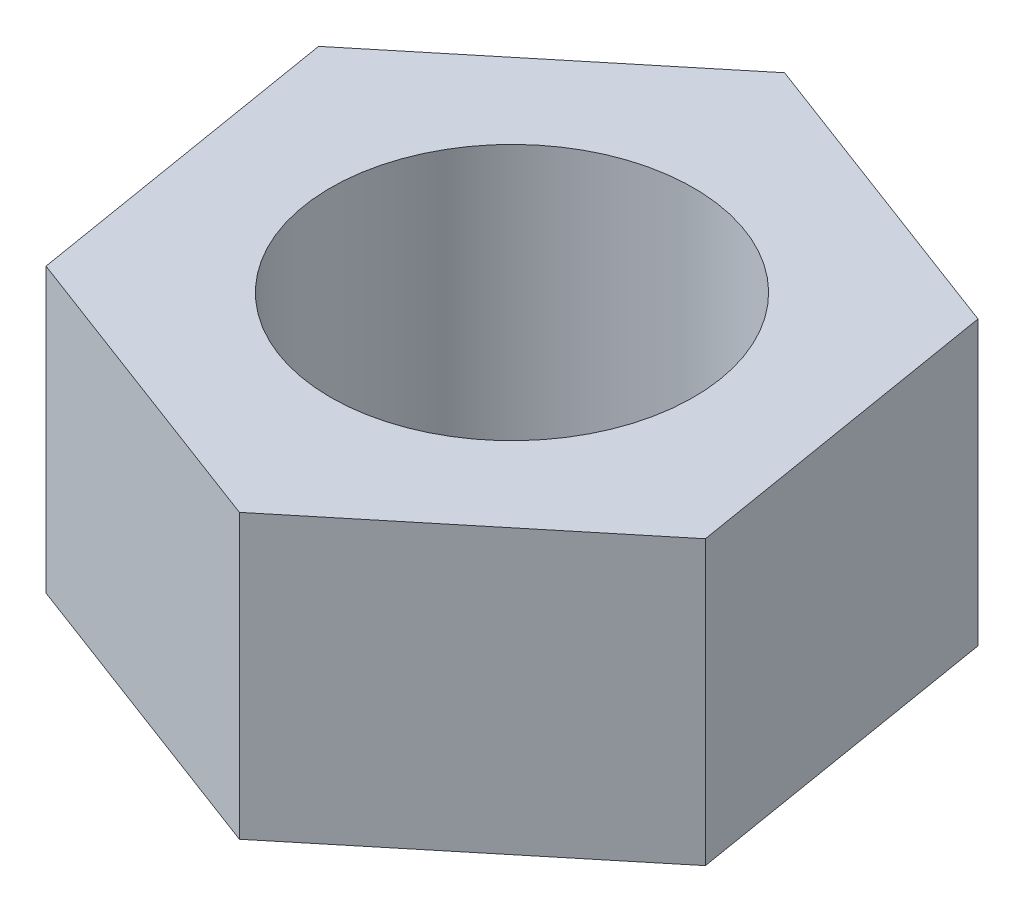
ISO-10303-21;
HEADER;
FILE_DESCRIPTION(('STEP AP214'),'2;1');
FILE_NAME('part.step','',(''),(''),'','','');
FILE_SCHEMA(('AUTOMOTIVE_DESIGN { 1 0 10303 214 1 1 1 1 }'));
ENDSEC;
DATA;
#1=APPLICATION_CONTEXT('core data for automotive mechanical design processes');
#2=APPLICATION_PROTOCOL_DEFINITION('international standard','automotive_design',2000,#1);
#3=PRODUCT_CONTEXT('',#1,'mechanical');
#4=PRODUCT('Part','Part','',(#3));
#5=PRODUCT_RELATED_PRODUCT_CATEGORY('part','',(#4));
#6=PRODUCT_DEFINITION_FORMATION('','',#4);
#7=PRODUCT_DEFINITION_CONTEXT('part definition',#1,'design');
#8=PRODUCT_DEFINITION('design','',#6,#7);
#9=PRODUCT_DEFINITION_SHAPE('','',#8);
#10=(LENGTH_UNIT() NAMED_UNIT(*) SI_UNIT(.MILLI.,.METRE.));
#11=(NAMED_UNIT(*) PLANE_ANGLE_UNIT() SI_UNIT($,.RADIAN.));
#12=(NAMED_UNIT(*) SI_UNIT($,.STERADIAN.) SOLID_ANGLE_UNIT());
#13=UNCERTAINTY_MEASURE_WITH_UNIT(LENGTH_MEASURE(1.E-05),#10,'distance_accuracy_value','');
#14=(GEOMETRIC_REPRESENTATION_CONTEXT(3) GLOBAL_UNCERTAINTY_ASSIGNED_CONTEXT((#13)) GLOBAL_UNIT_ASSIGNED_CONTEXT((#10,
#11,#12)) REPRESENTATION_CONTEXT('',''));
#15=CARTESIAN_POINT('',(0.,0.,0.));
#16=DIRECTION('',(0.,0.,1.));
#17=DIRECTION('',(1.,0.,0.));
#18=AXIS2_PLACEMENT_3D('',#15,#16,#17);
#19=CARTESIAN_POINT('',(0.,3.9,0.));
#20=DIRECTION('',(0.,1.,0.));
#21=DIRECTION('',(0.,0.,1.));
#22=AXIS2_PLACEMENT_3D('',#19,#20,#21);
#23=PLANE('',#22);
#24=DIRECTION('',(-0.163255074039928,0.,-0.986583894456127));
#25=VECTOR('',#24,1.);
#26=CARTESIAN_POINT('',(4.26931505882862,3.9,1.60508014185974));
#27=LINE('',#26,#25);
#28=CARTESIAN_POINT('',(4.26931505882862,3.9,1.60508014185974));
#29=VERTEX_POINT('',#28);
#30=CARTESIAN_POINT('',(3.52469770737478,3.9,-2.89479522677517));
#31=VERTEX_POINT('',#30);
#32=EDGE_CURVE('E146',#29,#31,#27,.T.);
#33=ORIENTED_EDGE('',*,*,#32,.T.);
#34=DIRECTION('',(-0.936034252583555,0.,-0.351908905812776));
#35=VECTOR('',#34,1.);
#36=CARTESIAN_POINT('',(3.52469770737478,3.9,-2.89479522677517));
#37=LINE('',#36,#35);
#38=CARTESIAN_POINT('',(-0.744617351453845,3.9,-4.49987536863491));
#39=VERTEX_POINT('',#38);
#40=EDGE_CURVE('E94',#31,#39,#37,.T.);
#41=ORIENTED_EDGE('',*,*,#40,.T.);
#42=DIRECTION('',(-0.772779178543627,0.,0.63467498864335));
#43=VECTOR('',#42,1.);
#44=CARTESIAN_POINT('',(-0.744617351453845,3.9,-4.49987536863491));
#45=LINE('',#44,#43);
#46=CARTESIAN_POINT('',(-4.26931505882862,3.9,-1.60508014185974));
#47=VERTEX_POINT('',#46);
#48=EDGE_CURVE('E107',#39,#47,#45,.T.);
#49=ORIENTED_EDGE('',*,*,#48,.T.);
#50=DIRECTION('',(0.163255074039928,0.,0.986583894456126));
#51=VECTOR('',#50,1.);
#52=CARTESIAN_POINT('',(-4.26931505882862,3.9,-1.60508014185974));
#53=LINE('',#52,#51);
#54=CARTESIAN_POINT('',(-3.52469770737478,3.9,2.89479522677517));
#55=VERTEX_POINT('',#54);
#56=EDGE_CURVE('E101',#47,#55,#53,.T.);
#57=ORIENTED_EDGE('',*,*,#56,.T.);
#58=DIRECTION('',(0.936034252583555,0.,0.351908905812776));
#59=VECTOR('',#58,1.);
#60=CARTESIAN_POINT('',(-3.52469770737478,3.9,2.89479522677517));
#61=LINE('',#60,#59);
#62=CARTESIAN_POINT('',(0.744617351453847,3.9,4.49987536863491));
#63=VERTEX_POINT('',#62);
#64=EDGE_CURVE('E105',#55,#63,#61,.T.);
#65=ORIENTED_EDGE('',*,*,#64,.T.);
#66=DIRECTION('',(0.772779178543627,0.,-0.634674988643351));
#67=VECTOR('',#66,1.);
#68=CARTESIAN_POINT('',(0.744617351453847,3.9,4.49987536863491));
#69=LINE('',#68,#67);
#70=EDGE_CURVE('E57',#63,#29,#69,.T.);
#71=ORIENTED_EDGE('',*,*,#70,.T.);
#72=EDGE_LOOP('',(#33,#41,#49,#57,#65,#71));
#73=FACE_BOUND('',#72,.T.);
#74=CARTESIAN_POINT('',(0.,3.9,0.));
#75=DIRECTION('',(0.,1.,0.));
#76=DIRECTION('',(0.,0.,1.));
#77=AXIS2_PLACEMENT_3D('',#74,#75,#76);
#78=CIRCLE('',#77,2.5);
#79=CARTESIAN_POINT('',(0.,3.9,2.5));
#80=VERTEX_POINT('',#79);
#81=EDGE_CURVE('E134',#80,#80,#78,.T.);
#82=ORIENTED_EDGE('',*,*,#81,.F.);
#83=EDGE_LOOP('',(#82));
#84=FACE_BOUND('',#83,.T.);
#85=ADVANCED_FACE('F39',(#73,#84),#23,.T.);
#86=CARTESIAN_POINT('',(0.,0.,0.));
#87=DIRECTION('',(0.,1.,0.));
#88=DIRECTION('',(0.,0.,1.));
#89=AXIS2_PLACEMENT_3D('',#86,#87,#88);
#90=PLANE('',#89);
#91=DIRECTION('',(-0.163255074039928,0.,-0.986583894456127));
#92=VECTOR('',#91,1.);
#93=CARTESIAN_POINT('',(4.26931505882862,0.,1.60508014185974));
#94=LINE('',#93,#92);
#95=CARTESIAN_POINT('',(4.26931505882862,0.,1.60508014185974));
#96=VERTEX_POINT('',#95);
#97=CARTESIAN_POINT('',(3.52469770737478,0.,-2.89479522677517));
#98=VERTEX_POINT('',#97);
#99=EDGE_CURVE('E129',#96,#98,#94,.T.);
#100=ORIENTED_EDGE('',*,*,#99,.F.);
#101=DIRECTION('',(0.772779178543627,0.,-0.634674988643351));
#102=VECTOR('',#101,1.);
#103=CARTESIAN_POINT('',(0.744617351453847,0.,4.49987536863491));
#104=LINE('',#103,#102);
#105=CARTESIAN_POINT('',(0.744617351453847,0.,4.49987536863491));
#106=VERTEX_POINT('',#105);
#107=EDGE_CURVE('E86',#106,#96,#104,.T.);
#108=ORIENTED_EDGE('',*,*,#107,.F.);
#109=DIRECTION('',(0.936034252583555,0.,0.351908905812776));
#110=VECTOR('',#109,1.);
#111=CARTESIAN_POINT('',(-3.52469770737478,0.,2.89479522677517));
#112=LINE('',#111,#110);
#113=CARTESIAN_POINT('',(-3.52469770737478,0.,2.89479522677517));
#114=VERTEX_POINT('',#113);
#115=EDGE_CURVE('E80',#114,#106,#112,.T.);
#116=ORIENTED_EDGE('',*,*,#115,.F.);
#117=DIRECTION('',(0.163255074039928,0.,0.986583894456126));
#118=VECTOR('',#117,1.);
#119=CARTESIAN_POINT('',(-4.26931505882862,0.,-1.60508014185974));
#120=LINE('',#119,#118);
#121=CARTESIAN_POINT('',(-4.26931505882862,0.,-1.60508014185974));
#122=VERTEX_POINT('',#121);
#123=EDGE_CURVE('E116',#122,#114,#120,.T.);
#124=ORIENTED_EDGE('',*,*,#123,.F.);
#125=DIRECTION('',(-0.772779178543627,0.,0.63467498864335));
#126=VECTOR('',#125,1.);
#127=CARTESIAN_POINT('',(-0.744617351453845,0.,-4.49987536863491));
#128=LINE('',#127,#126);
#129=CARTESIAN_POINT('',(-0.744617351453845,0.,-4.49987536863491));
#130=VERTEX_POINT('',#129);
#131=EDGE_CURVE('E137',#130,#122,#128,.T.);
#132=ORIENTED_EDGE('',*,*,#131,.F.);
#133=DIRECTION('',(-0.936034252583555,0.,-0.351908905812776));
#134=VECTOR('',#133,1.);
#135=CARTESIAN_POINT('',(3.52469770737478,0.,-2.89479522677517));
#136=LINE('',#135,#134);
#137=EDGE_CURVE('E133',#98,#130,#136,.T.);
#138=ORIENTED_EDGE('',*,*,#137,.F.);
#139=EDGE_LOOP('',(#100,#108,#116,#124,#132,#138));
#140=FACE_BOUND('',#139,.T.);
#141=CARTESIAN_POINT('',(0.,0.,0.));
#142=DIRECTION('',(0.,1.,0.));
#143=DIRECTION('',(0.,0.,1.));
#144=AXIS2_PLACEMENT_3D('',#141,#142,#143);
#145=CIRCLE('',#144,2.5);
#146=CARTESIAN_POINT('',(0.,0.,2.5));
#147=VERTEX_POINT('',#146);
#148=EDGE_CURVE('E243',#147,#147,#145,.T.);
#149=ORIENTED_EDGE('',*,*,#148,.T.);
#150=EDGE_LOOP('',(#149));
#151=FACE_BOUND('',#150,.T.);
#152=ADVANCED_FACE('F159',(#140,#151),#90,.F.);
#153=CARTESIAN_POINT('',(4.26931505882862,3.9,1.60508014185974));
#154=DIRECTION('',(-0.986583894456127,0.,0.163255074039928));
#155=DIRECTION('',(0.163255074039928,0.,0.986583894456127));
#156=AXIS2_PLACEMENT_3D('',#153,#154,#155);
#157=PLANE('',#156);
#158=ORIENTED_EDGE('',*,*,#99,.T.);
#159=DIRECTION('',(0.,-1.,0.));
#160=VECTOR('',#159,1.);
#161=CARTESIAN_POINT('',(3.52469770737478,3.9,-2.89479522677517));
#162=LINE('',#161,#160);
#163=EDGE_CURVE('E11',#31,#98,#162,.T.);
#164=ORIENTED_EDGE('',*,*,#163,.F.);
#165=ORIENTED_EDGE('',*,*,#32,.F.);
#166=DIRECTION('',(0.,-1.,0.));
#167=VECTOR('',#166,1.);
#168=CARTESIAN_POINT('',(4.26931505882862,3.9,1.60508014185974));
#169=LINE('',#168,#167);
#170=EDGE_CURVE('E125',#29,#96,#169,.T.);
#171=ORIENTED_EDGE('',*,*,#170,.T.);
#172=EDGE_LOOP('',(#158,#164,#165,#171));
#173=FACE_BOUND('',#172,.T.);
#174=ADVANCED_FACE('F41',(#173),#157,.F.);
#175=CARTESIAN_POINT('',(3.52469770737478,3.9,-2.89479522677517));
#176=DIRECTION('',(-0.351908905812776,0.,0.936034252583555));
#177=DIRECTION('',(0.936034252583555,0.,0.351908905812776));
#178=AXIS2_PLACEMENT_3D('',#175,#176,#177);
#179=PLANE('',#178);
#180=ORIENTED_EDGE('',*,*,#137,.T.);
#181=DIRECTION('',(0.,-1.,0.));
#182=VECTOR('',#181,1.);
#183=CARTESIAN_POINT('',(-0.744617351453845,3.9,-4.49987536863491));
#184=LINE('',#183,#182);
#185=EDGE_CURVE('E49',#39,#130,#184,.T.);
#186=ORIENTED_EDGE('',*,*,#185,.F.);
#187=ORIENTED_EDGE('',*,*,#40,.F.);
#188=ORIENTED_EDGE('',*,*,#163,.T.);
#189=EDGE_LOOP('',(#180,#186,#187,#188));
#190=FACE_BOUND('',#189,.T.);
#191=ADVANCED_FACE('F184',(#190),#179,.F.);
#192=CARTESIAN_POINT('',(-0.744617351453845,3.9,-4.49987536863491));
#193=DIRECTION('',(0.63467498864335,0.,0.772779178543627));
#194=DIRECTION('',(0.772779178543627,0.,-0.63467498864335));
#195=AXIS2_PLACEMENT_3D('',#192,#193,#194);
#196=PLANE('',#195);
#197=ORIENTED_EDGE('',*,*,#131,.T.);
#198=DIRECTION('',(0.,-1.,0.));
#199=VECTOR('',#198,1.);
#200=CARTESIAN_POINT('',(-4.26931505882862,3.9,-1.60508014185974));
#201=LINE('',#200,#199);
#202=EDGE_CURVE('E118',#47,#122,#201,.T.);
#203=ORIENTED_EDGE('',*,*,#202,.F.);
#204=ORIENTED_EDGE('',*,*,#48,.F.);
#205=ORIENTED_EDGE('',*,*,#185,.T.);
#206=EDGE_LOOP('',(#197,#203,#204,#205));
#207=FACE_BOUND('',#206,.T.);
#208=ADVANCED_FACE('F156',(#207),#196,.F.);
#209=CARTESIAN_POINT('',(-4.26931505882862,3.9,-1.60508014185974));
#210=DIRECTION('',(0.986583894456127,0.,-0.163255074039928));
#211=DIRECTION('',(-0.163255074039928,0.,-0.986583894456127));
#212=AXIS2_PLACEMENT_3D('',#209,#210,#211);
#213=PLANE('',#212);
#214=ORIENTED_EDGE('',*,*,#123,.T.);
#215=DIRECTION('',(0.,-1.,0.));
#216=VECTOR('',#215,1.);
#217=CARTESIAN_POINT('',(-3.52469770737478,3.9,2.89479522677517));
#218=LINE('',#217,#216);
#219=EDGE_CURVE('E113',#55,#114,#218,.T.);
#220=ORIENTED_EDGE('',*,*,#219,.F.);
#221=ORIENTED_EDGE('',*,*,#56,.F.);
#222=ORIENTED_EDGE('',*,*,#202,.T.);
#223=EDGE_LOOP('',(#214,#220,#221,#222));
#224=FACE_BOUND('',#223,.T.);
#225=ADVANCED_FACE('F114',(#224),#213,.F.);
#226=CARTESIAN_POINT('',(-3.52469770737478,3.9,2.89479522677517));
#227=DIRECTION('',(0.351908905812776,0.,-0.936034252583555));
#228=DIRECTION('',(-0.936034252583555,0.,-0.351908905812776));
#229=AXIS2_PLACEMENT_3D('',#226,#227,#228);
#230=PLANE('',#229);
#231=ORIENTED_EDGE('',*,*,#115,.T.);
#232=DIRECTION('',(0.,-1.,0.));
#233=VECTOR('',#232,1.);
#234=CARTESIAN_POINT('',(0.744617351453847,3.9,4.49987536863491));
#235=LINE('',#234,#233);
#236=EDGE_CURVE('E119',#63,#106,#235,.T.);
#237=ORIENTED_EDGE('',*,*,#236,.F.);
#238=ORIENTED_EDGE('',*,*,#64,.F.);
#239=ORIENTED_EDGE('',*,*,#219,.T.);
#240=EDGE_LOOP('',(#231,#237,#238,#239));
#241=FACE_BOUND('',#240,.T.);
#242=ADVANCED_FACE('F121',(#241),#230,.F.);
#243=CARTESIAN_POINT('',(0.744617351453847,3.9,4.49987536863491));
#244=DIRECTION('',(-0.634674988643351,0.,-0.772779178543627));
#245=DIRECTION('',(-0.772779178543627,0.,0.634674988643351));
#246=AXIS2_PLACEMENT_3D('',#243,#244,#245);
#247=PLANE('',#246);
#248=ORIENTED_EDGE('',*,*,#107,.T.);
#249=ORIENTED_EDGE('',*,*,#170,.F.);
#250=ORIENTED_EDGE('',*,*,#70,.F.);
#251=ORIENTED_EDGE('',*,*,#236,.T.);
#252=EDGE_LOOP('',(#248,#249,#250,#251));
#253=FACE_BOUND('',#252,.T.);
#254=ADVANCED_FACE('F164',(#253),#247,.F.);
#255=CARTESIAN_POINT('',(0.,3.9,0.));
#256=DIRECTION('',(0.,-1.,0.));
#257=DIRECTION('',(0.,0.,-1.));
#258=AXIS2_PLACEMENT_3D('',#255,#256,#257);
#259=CYLINDRICAL_SURFACE('',#258,2.5);
#260=ORIENTED_EDGE('',*,*,#81,.T.);
#261=EDGE_LOOP('',(#260));
#262=FACE_BOUND('',#261,.T.);
#263=ORIENTED_EDGE('',*,*,#148,.F.);
#264=EDGE_LOOP('',(#263));
#265=FACE_BOUND('',#264,.T.);
#266=ADVANCED_FACE('F166',(#262,#265),#259,.F.);
#267=CLOSED_SHELL('',(#85,#152,#174,#191,#208,#225,#242,#254,#266));
#268=MANIFOLD_SOLID_BREP('B2',#267);
#269=ADVANCED_BREP_SHAPE_REPRESENTATION('',(#18,#268),#14);
#270=SHAPE_DEFINITION_REPRESENTATION(#9,#269);
ENDSEC;
END-ISO-10303-21;
